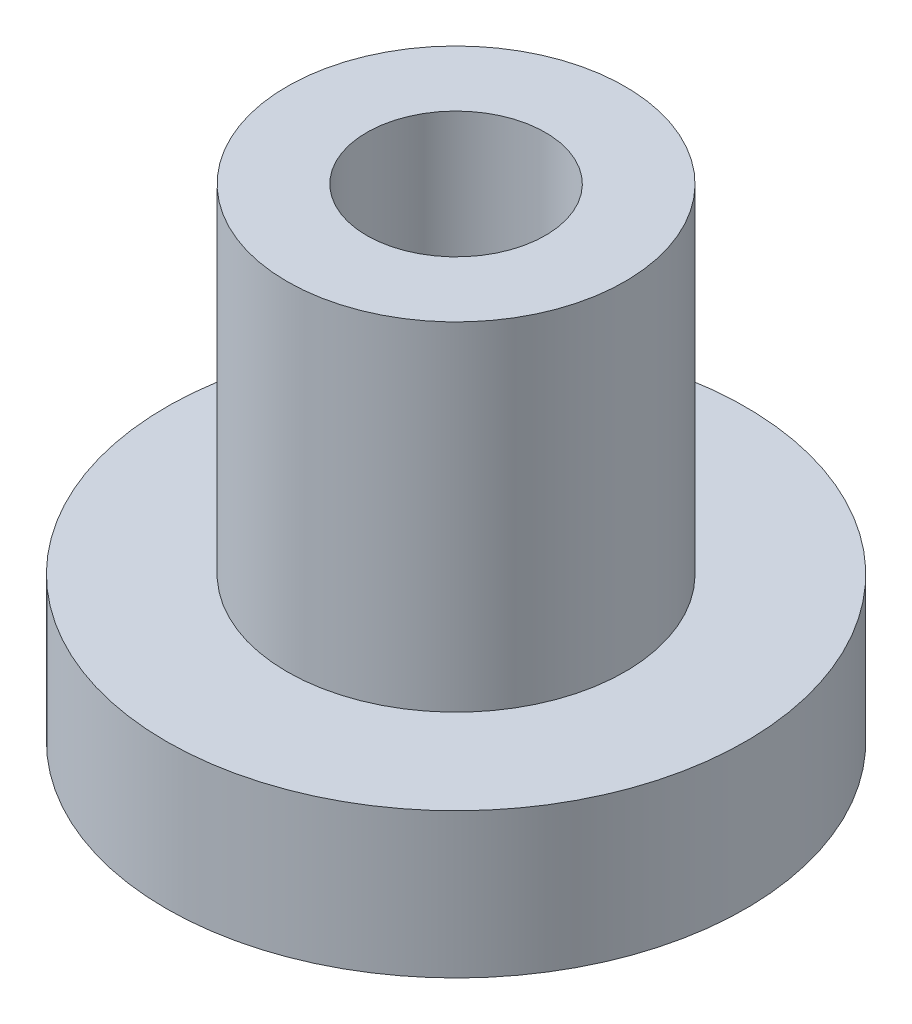
ISO-10303-21;
HEADER;
FILE_DESCRIPTION(('STEP AP214'),'2;1');
FILE_NAME('part.step','',(''),(''),'','','');
FILE_SCHEMA(('AUTOMOTIVE_DESIGN { 1 0 10303 214 1 1 1 1 }'));
ENDSEC;
DATA;
#1=APPLICATION_CONTEXT('core data for automotive mechanical design processes');
#2=APPLICATION_PROTOCOL_DEFINITION('international standard','automotive_design',2000,#1);
#3=PRODUCT_CONTEXT('',#1,'mechanical');
#4=PRODUCT('Part','Part','',(#3));
#5=PRODUCT_RELATED_PRODUCT_CATEGORY('part','',(#4));
#6=PRODUCT_DEFINITION_FORMATION('','',#4);
#7=PRODUCT_DEFINITION_CONTEXT('part definition',#1,'design');
#8=PRODUCT_DEFINITION('design','',#6,#7);
#9=PRODUCT_DEFINITION_SHAPE('','',#8);
#10=(LENGTH_UNIT() NAMED_UNIT(*) SI_UNIT(.MILLI.,.METRE.));
#11=(NAMED_UNIT(*) PLANE_ANGLE_UNIT() SI_UNIT($,.RADIAN.));
#12=(NAMED_UNIT(*) SI_UNIT($,.STERADIAN.) SOLID_ANGLE_UNIT());
#13=UNCERTAINTY_MEASURE_WITH_UNIT(LENGTH_MEASURE(1.E-05),#10,'distance_accuracy_value','');
#14=(GEOMETRIC_REPRESENTATION_CONTEXT(3) GLOBAL_UNCERTAINTY_ASSIGNED_CONTEXT((#13)) GLOBAL_UNIT_ASSIGNED_CONTEXT((#10,
#11,#12)) REPRESENTATION_CONTEXT('',''));
#15=CARTESIAN_POINT('',(0.,0.,0.));
#16=DIRECTION('',(0.,0.,1.));
#17=DIRECTION('',(1.,0.,0.));
#18=AXIS2_PLACEMENT_3D('',#15,#16,#17);
#19=CARTESIAN_POINT('',(0.,3.,0.));
#20=DIRECTION('',(0.,1.,0.));
#21=DIRECTION('',(0.,0.,1.));
#22=AXIS2_PLACEMENT_3D('',#19,#20,#21);
#23=PLANE('',#22);
#24=CARTESIAN_POINT('',(0.,3.,0.));
#25=DIRECTION('',(0.,1.,0.));
#26=DIRECTION('',(0.,0.,1.));
#27=AXIS2_PLACEMENT_3D('',#24,#25,#26);
#28=CIRCLE('',#27,6.);
#29=CARTESIAN_POINT('',(0.,3.,6.));
#30=VERTEX_POINT('',#29);
#31=EDGE_CURVE('E10',#30,#30,#28,.T.);
#32=ORIENTED_EDGE('',*,*,#31,.T.);
#33=EDGE_LOOP('',(#32));
#34=FACE_BOUND('',#33,.T.);
#35=CARTESIAN_POINT('',(0.,3.,0.));
#36=DIRECTION('',(0.,1.,0.));
#37=DIRECTION('',(0.,0.,1.));
#38=AXIS2_PLACEMENT_3D('',#35,#36,#37);
#39=CIRCLE('',#38,3.5);
#40=CARTESIAN_POINT('',(0.,3.,3.5));
#41=VERTEX_POINT('',#40);
#42=EDGE_CURVE('E48',#41,#41,#39,.T.);
#43=ORIENTED_EDGE('',*,*,#42,.F.);
#44=EDGE_LOOP('',(#43));
#45=FACE_BOUND('',#44,.T.);
#46=ADVANCED_FACE('F32',(#34,#45),#23,.T.);
#47=CARTESIAN_POINT('',(0.,0.,0.));
#48=DIRECTION('',(0.,1.,0.));
#49=DIRECTION('',(0.,0.,1.));
#50=AXIS2_PLACEMENT_3D('',#47,#48,#49);
#51=PLANE('',#50);
#52=CARTESIAN_POINT('',(0.,0.,0.));
#53=DIRECTION('',(0.,1.,0.));
#54=DIRECTION('',(0.,0.,1.));
#55=AXIS2_PLACEMENT_3D('',#52,#53,#54);
#56=CIRCLE('',#55,6.);
#57=CARTESIAN_POINT('',(0.,0.,6.));
#58=VERTEX_POINT('',#57);
#59=EDGE_CURVE('E36',#58,#58,#56,.T.);
#60=ORIENTED_EDGE('',*,*,#59,.F.);
#61=EDGE_LOOP('',(#60));
#62=FACE_BOUND('',#61,.T.);
#63=CARTESIAN_POINT('',(0.,0.,0.));
#64=DIRECTION('',(0.,1.,0.));
#65=DIRECTION('',(0.,0.,1.));
#66=AXIS2_PLACEMENT_3D('',#63,#64,#65);
#67=CIRCLE('',#66,1.85);
#68=CARTESIAN_POINT('',(0.,0.,1.85));
#69=VERTEX_POINT('',#68);
#70=EDGE_CURVE('E43',#69,#69,#67,.T.);
#71=ORIENTED_EDGE('',*,*,#70,.T.);
#72=EDGE_LOOP('',(#71));
#73=FACE_BOUND('',#72,.T.);
#74=ADVANCED_FACE('F73',(#62,#73),#51,.F.);
#75=CARTESIAN_POINT('',(0.,3.,0.));
#76=DIRECTION('',(0.,-1.,0.));
#77=DIRECTION('',(0.,0.,-1.));
#78=AXIS2_PLACEMENT_3D('',#75,#76,#77);
#79=CYLINDRICAL_SURFACE('',#78,6.);
#80=ORIENTED_EDGE('',*,*,#31,.F.);
#81=EDGE_LOOP('',(#80));
#82=FACE_BOUND('',#81,.T.);
#83=ORIENTED_EDGE('',*,*,#59,.T.);
#84=EDGE_LOOP('',(#83));
#85=FACE_BOUND('',#84,.T.);
#86=ADVANCED_FACE('F34',(#82,#85),#79,.T.);
#87=CARTESIAN_POINT('',(0.,3.,0.));
#88=DIRECTION('',(0.,-1.,0.));
#89=DIRECTION('',(0.,0.,-1.));
#90=AXIS2_PLACEMENT_3D('',#87,#88,#89);
#91=CYLINDRICAL_SURFACE('',#90,1.85);
#92=ORIENTED_EDGE('',*,*,#70,.F.);
#93=EDGE_LOOP('',(#92));
#94=FACE_BOUND('',#93,.T.);
#95=CARTESIAN_POINT('',(0.,10.,0.));
#96=DIRECTION('',(0.,1.,0.));
#97=DIRECTION('',(0.,0.,1.));
#98=AXIS2_PLACEMENT_3D('',#95,#96,#97);
#99=CIRCLE('',#98,1.85);
#100=CARTESIAN_POINT('',(0.,10.,1.85));
#101=VERTEX_POINT('',#100);
#102=EDGE_CURVE('E51',#101,#101,#99,.T.);
#103=ORIENTED_EDGE('',*,*,#102,.T.);
#104=EDGE_LOOP('',(#103));
#105=FACE_BOUND('',#104,.T.);
#106=ADVANCED_FACE('F57',(#94,#105),#91,.F.);
#107=CARTESIAN_POINT('',(0.,10.,0.));
#108=DIRECTION('',(0.,1.,0.));
#109=DIRECTION('',(0.,0.,1.));
#110=AXIS2_PLACEMENT_3D('',#107,#108,#109);
#111=PLANE('',#110);
#112=CARTESIAN_POINT('',(0.,10.,0.));
#113=DIRECTION('',(0.,1.,0.));
#114=DIRECTION('',(0.,0.,1.));
#115=AXIS2_PLACEMENT_3D('',#112,#113,#114);
#116=CIRCLE('',#115,3.5);
#117=CARTESIAN_POINT('',(0.,10.,3.5));
#118=VERTEX_POINT('',#117);
#119=EDGE_CURVE('E47',#118,#118,#116,.T.);
#120=ORIENTED_EDGE('',*,*,#119,.T.);
#121=EDGE_LOOP('',(#120));
#122=FACE_BOUND('',#121,.T.);
#123=ORIENTED_EDGE('',*,*,#102,.F.);
#124=EDGE_LOOP('',(#123));
#125=FACE_BOUND('',#124,.T.);
#126=ADVANCED_FACE('F59',(#122,#125),#111,.T.);
#127=CARTESIAN_POINT('',(0.,10.,0.));
#128=DIRECTION('',(0.,-1.,0.));
#129=DIRECTION('',(0.,0.,-1.));
#130=AXIS2_PLACEMENT_3D('',#127,#128,#129);
#131=CYLINDRICAL_SURFACE('',#130,3.5);
#132=ORIENTED_EDGE('',*,*,#119,.F.);
#133=EDGE_LOOP('',(#132));
#134=FACE_BOUND('',#133,.T.);
#135=ORIENTED_EDGE('',*,*,#42,.T.);
#136=EDGE_LOOP('',(#135));
#137=FACE_BOUND('',#136,.T.);
#138=ADVANCED_FACE('F61',(#134,#137),#131,.T.);
#139=CLOSED_SHELL('',(#46,#74,#86,#106,#126,#138));
#140=MANIFOLD_SOLID_BREP('B2',#139);
#141=ADVANCED_BREP_SHAPE_REPRESENTATION('',(#18,#140),#14);
#142=SHAPE_DEFINITION_REPRESENTATION(#9,#141);
ENDSEC;
END-ISO-10303-21;
